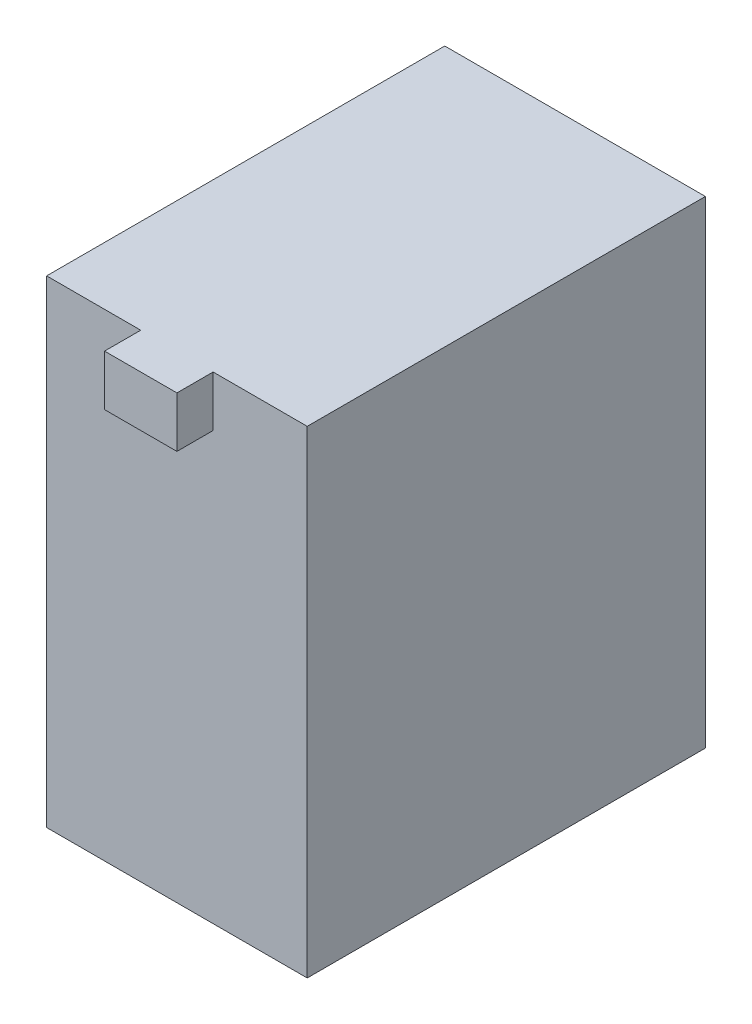
ISO-10303-21;
HEADER;
FILE_DESCRIPTION(('STEP AP214'),'2;1');
FILE_NAME('part.step','',(''),(''),'','','');
FILE_SCHEMA(('AUTOMOTIVE_DESIGN { 1 0 10303 214 1 1 1 1 }'));
ENDSEC;
DATA;
#1=APPLICATION_CONTEXT('core data for automotive mechanical design processes');
#2=APPLICATION_PROTOCOL_DEFINITION('international standard','automotive_design',2000,#1);
#3=PRODUCT_CONTEXT('',#1,'mechanical');
#4=PRODUCT('Part','Part','',(#3));
#5=PRODUCT_RELATED_PRODUCT_CATEGORY('part','',(#4));
#6=PRODUCT_DEFINITION_FORMATION('','',#4);
#7=PRODUCT_DEFINITION_CONTEXT('part definition',#1,'design');
#8=PRODUCT_DEFINITION('design','',#6,#7);
#9=PRODUCT_DEFINITION_SHAPE('','',#8);
#10=(LENGTH_UNIT() NAMED_UNIT(*) SI_UNIT(.MILLI.,.METRE.));
#11=(NAMED_UNIT(*) PLANE_ANGLE_UNIT() SI_UNIT($,.RADIAN.));
#12=(NAMED_UNIT(*) SI_UNIT($,.STERADIAN.) SOLID_ANGLE_UNIT());
#13=UNCERTAINTY_MEASURE_WITH_UNIT(LENGTH_MEASURE(1.E-05),#10,'distance_accuracy_value','');
#14=(GEOMETRIC_REPRESENTATION_CONTEXT(3) GLOBAL_UNCERTAINTY_ASSIGNED_CONTEXT((#13)) GLOBAL_UNIT_ASSIGNED_CONTEXT((#10,
#11,#12)) REPRESENTATION_CONTEXT('',''));
#15=CARTESIAN_POINT('',(0.,0.,0.));
#16=DIRECTION('',(0.,0.,1.));
#17=DIRECTION('',(1.,0.,0.));
#18=AXIS2_PLACEMENT_3D('',#15,#16,#17);
#19=CARTESIAN_POINT('',(-18.,66.,27.5));
#20=DIRECTION('',(0.,0.,-1.));
#21=DIRECTION('',(-1.,0.,0.));
#22=AXIS2_PLACEMENT_3D('',#19,#20,#21);
#23=PLANE('',#22);
#24=DIRECTION('',(0.,1.,0.));
#25=VECTOR('',#24,1.);
#26=CARTESIAN_POINT('',(5.,66.,27.5));
#27=LINE('',#26,#25);
#28=CARTESIAN_POINT('',(5.,59.,27.5));
#29=VERTEX_POINT('',#28);
#30=CARTESIAN_POINT('',(5.,66.,27.5));
#31=VERTEX_POINT('',#30);
#32=EDGE_CURVE('E55',#29,#31,#27,.T.);
#33=ORIENTED_EDGE('',*,*,#32,.F.);
#34=DIRECTION('',(1.,0.,0.));
#35=VECTOR('',#34,1.);
#36=CARTESIAN_POINT('',(5.,59.,27.5));
#37=LINE('',#36,#35);
#38=CARTESIAN_POINT('',(-5.,59.,27.5));
#39=VERTEX_POINT('',#38);
#40=EDGE_CURVE('E124',#39,#29,#37,.T.);
#41=ORIENTED_EDGE('',*,*,#40,.F.);
#42=DIRECTION('',(0.,-1.,0.));
#43=VECTOR('',#42,1.);
#44=CARTESIAN_POINT('',(-5.,66.,27.5));
#45=LINE('',#44,#43);
#46=CARTESIAN_POINT('',(-5.,66.,27.5));
#47=VERTEX_POINT('',#46);
#48=EDGE_CURVE('E280',#47,#39,#45,.T.);
#49=ORIENTED_EDGE('',*,*,#48,.F.);
#50=DIRECTION('',(1.,0.,0.));
#51=VECTOR('',#50,1.);
#52=CARTESIAN_POINT('',(-18.,66.,27.5));
#53=LINE('',#52,#51);
#54=CARTESIAN_POINT('',(-18.,66.,27.5));
#55=VERTEX_POINT('',#54);
#56=EDGE_CURVE('E143',#55,#47,#53,.T.);
#57=ORIENTED_EDGE('',*,*,#56,.F.);
#58=DIRECTION('',(0.,-1.,0.));
#59=VECTOR('',#58,1.);
#60=CARTESIAN_POINT('',(-18.,66.,27.5));
#61=LINE('',#60,#59);
#62=CARTESIAN_POINT('',(-18.,0.,27.5));
#63=VERTEX_POINT('',#62);
#64=EDGE_CURVE('E152',#55,#63,#61,.T.);
#65=ORIENTED_EDGE('',*,*,#64,.T.);
#66=DIRECTION('',(1.,0.,0.));
#67=VECTOR('',#66,1.);
#68=CARTESIAN_POINT('',(-18.,0.,27.5));
#69=LINE('',#68,#67);
#70=CARTESIAN_POINT('',(18.,0.,27.5));
#71=VERTEX_POINT('',#70);
#72=EDGE_CURVE('E139',#63,#71,#69,.T.);
#73=ORIENTED_EDGE('',*,*,#72,.T.);
#74=DIRECTION('',(0.,-1.,0.));
#75=VECTOR('',#74,1.);
#76=CARTESIAN_POINT('',(18.,66.,27.5));
#77=LINE('',#76,#75);
#78=CARTESIAN_POINT('',(18.,66.,27.5));
#79=VERTEX_POINT('',#78);
#80=EDGE_CURVE('E144',#79,#71,#77,.T.);
#81=ORIENTED_EDGE('',*,*,#80,.F.);
#82=EDGE_CURVE('E60',#31,#79,#53,.T.);
#83=ORIENTED_EDGE('',*,*,#82,.F.);
#84=EDGE_LOOP('',(#33,#41,#49,#57,#65,#73,#81,#83));
#85=FACE_BOUND('',#84,.T.);
#86=ADVANCED_FACE('F40',(#85),#23,.F.);
#87=CARTESIAN_POINT('',(18.,66.,27.5));
#88=DIRECTION('',(-1.,0.,0.));
#89=DIRECTION('',(0.,0.,1.));
#90=AXIS2_PLACEMENT_3D('',#87,#88,#89);
#91=PLANE('',#90);
#92=DIRECTION('',(0.,0.,-1.));
#93=VECTOR('',#92,1.);
#94=CARTESIAN_POINT('',(18.,0.,27.5));
#95=LINE('',#94,#93);
#96=CARTESIAN_POINT('',(18.,0.,-27.5));
#97=VERTEX_POINT('',#96);
#98=EDGE_CURVE('E127',#71,#97,#95,.T.);
#99=ORIENTED_EDGE('',*,*,#98,.T.);
#100=DIRECTION('',(0.,-1.,0.));
#101=VECTOR('',#100,1.);
#102=CARTESIAN_POINT('',(18.,66.,-27.5));
#103=LINE('',#102,#101);
#104=CARTESIAN_POINT('',(18.,66.,-27.5));
#105=VERTEX_POINT('',#104);
#106=EDGE_CURVE('E11',#105,#97,#103,.T.);
#107=ORIENTED_EDGE('',*,*,#106,.F.);
#108=DIRECTION('',(0.,0.,-1.));
#109=VECTOR('',#108,1.);
#110=CARTESIAN_POINT('',(18.,66.,27.5));
#111=LINE('',#110,#109);
#112=EDGE_CURVE('E136',#79,#105,#111,.T.);
#113=ORIENTED_EDGE('',*,*,#112,.F.);
#114=ORIENTED_EDGE('',*,*,#80,.T.);
#115=EDGE_LOOP('',(#99,#107,#113,#114));
#116=FACE_BOUND('',#115,.T.);
#117=ADVANCED_FACE('F42',(#116),#91,.F.);
#118=CARTESIAN_POINT('',(-18.,66.,-27.5));
#119=DIRECTION('',(0.,0.,1.));
#120=DIRECTION('',(1.,0.,0.));
#121=AXIS2_PLACEMENT_3D('',#118,#119,#120);
#122=PLANE('',#121);
#123=DIRECTION('',(-1.,0.,0.));
#124=VECTOR('',#123,1.);
#125=CARTESIAN_POINT('',(-18.,0.,-27.5));
#126=LINE('',#125,#124);
#127=CARTESIAN_POINT('',(-18.,0.,-27.5));
#128=VERTEX_POINT('',#127);
#129=EDGE_CURVE('E130',#97,#128,#126,.T.);
#130=ORIENTED_EDGE('',*,*,#129,.T.);
#131=DIRECTION('',(0.,-1.,0.));
#132=VECTOR('',#131,1.);
#133=CARTESIAN_POINT('',(-18.,66.,-27.5));
#134=LINE('',#133,#132);
#135=CARTESIAN_POINT('',(-18.,66.,-27.5));
#136=VERTEX_POINT('',#135);
#137=EDGE_CURVE('E48',#136,#128,#134,.T.);
#138=ORIENTED_EDGE('',*,*,#137,.F.);
#139=DIRECTION('',(-1.,0.,0.));
#140=VECTOR('',#139,1.);
#141=CARTESIAN_POINT('',(-18.,66.,-27.5));
#142=LINE('',#141,#140);
#143=EDGE_CURVE('E138',#105,#136,#142,.T.);
#144=ORIENTED_EDGE('',*,*,#143,.F.);
#145=ORIENTED_EDGE('',*,*,#106,.T.);
#146=EDGE_LOOP('',(#130,#138,#144,#145));
#147=FACE_BOUND('',#146,.T.);
#148=ADVANCED_FACE('F170',(#147),#122,.F.);
#149=CARTESIAN_POINT('',(-18.,66.,27.5));
#150=DIRECTION('',(1.,0.,0.));
#151=DIRECTION('',(0.,0.,-1.));
#152=AXIS2_PLACEMENT_3D('',#149,#150,#151);
#153=PLANE('',#152);
#154=DIRECTION('',(0.,0.,1.));
#155=VECTOR('',#154,1.);
#156=CARTESIAN_POINT('',(-18.,0.,27.5));
#157=LINE('',#156,#155);
#158=EDGE_CURVE('E147',#128,#63,#157,.T.);
#159=ORIENTED_EDGE('',*,*,#158,.T.);
#160=ORIENTED_EDGE('',*,*,#64,.F.);
#161=DIRECTION('',(0.,0.,1.));
#162=VECTOR('',#161,1.);
#163=CARTESIAN_POINT('',(-18.,66.,27.5));
#164=LINE('',#163,#162);
#165=EDGE_CURVE('E141',#136,#55,#164,.T.);
#166=ORIENTED_EDGE('',*,*,#165,.F.);
#167=ORIENTED_EDGE('',*,*,#137,.T.);
#168=EDGE_LOOP('',(#159,#160,#166,#167));
#169=FACE_BOUND('',#168,.T.);
#170=ADVANCED_FACE('F159',(#169),#153,.F.);
#171=CARTESIAN_POINT('',(0.,66.,0.));
#172=DIRECTION('',(0.,-1.,0.));
#173=DIRECTION('',(0.,0.,-1.));
#174=AXIS2_PLACEMENT_3D('',#171,#172,#173);
#175=PLANE('',#174);
#176=ORIENTED_EDGE('',*,*,#112,.T.);
#177=ORIENTED_EDGE('',*,*,#143,.T.);
#178=ORIENTED_EDGE('',*,*,#165,.T.);
#179=ORIENTED_EDGE('',*,*,#56,.T.);
#180=DIRECTION('',(0.,0.,-1.));
#181=VECTOR('',#180,1.);
#182=CARTESIAN_POINT('',(-5.,66.,32.5));
#183=LINE('',#182,#181);
#184=CARTESIAN_POINT('',(-5.,66.,32.5));
#185=VERTEX_POINT('',#184);
#186=EDGE_CURVE('E111',#185,#47,#183,.T.);
#187=ORIENTED_EDGE('',*,*,#186,.F.);
#188=DIRECTION('',(-1.,0.,0.));
#189=VECTOR('',#188,1.);
#190=CARTESIAN_POINT('',(-5.,66.,32.5));
#191=LINE('',#190,#189);
#192=CARTESIAN_POINT('',(5.,66.,32.5));
#193=VERTEX_POINT('',#192);
#194=EDGE_CURVE('E103',#193,#185,#191,.T.);
#195=ORIENTED_EDGE('',*,*,#194,.F.);
#196=DIRECTION('',(0.,0.,-1.));
#197=VECTOR('',#196,1.);
#198=CARTESIAN_POINT('',(5.,66.,32.5));
#199=LINE('',#198,#197);
#200=EDGE_CURVE('E108',#193,#31,#199,.T.);
#201=ORIENTED_EDGE('',*,*,#200,.T.);
#202=ORIENTED_EDGE('',*,*,#82,.T.);
#203=EDGE_LOOP('',(#176,#177,#178,#179,#187,#195,#201,#202));
#204=FACE_BOUND('',#203,.T.);
#205=ADVANCED_FACE('F106',(#204),#175,.F.);
#206=CARTESIAN_POINT('',(0.,0.,0.));
#207=DIRECTION('',(0.,-1.,0.));
#208=DIRECTION('',(0.,0.,-1.));
#209=AXIS2_PLACEMENT_3D('',#206,#207,#208);
#210=PLANE('',#209);
#211=ORIENTED_EDGE('',*,*,#98,.F.);
#212=ORIENTED_EDGE('',*,*,#72,.F.);
#213=ORIENTED_EDGE('',*,*,#158,.F.);
#214=ORIENTED_EDGE('',*,*,#129,.F.);
#215=EDGE_LOOP('',(#211,#212,#213,#214));
#216=FACE_BOUND('',#215,.T.);
#217=ADVANCED_FACE('F165',(#216),#210,.T.);
#218=CARTESIAN_POINT('',(5.,66.,32.5));
#219=DIRECTION('',(-1.,0.,0.));
#220=DIRECTION('',(0.,-1.,0.));
#221=AXIS2_PLACEMENT_3D('',#218,#219,#220);
#222=PLANE('',#221);
#223=ORIENTED_EDGE('',*,*,#32,.T.);
#224=ORIENTED_EDGE('',*,*,#200,.F.);
#225=DIRECTION('',(0.,1.,0.));
#226=VECTOR('',#225,1.);
#227=CARTESIAN_POINT('',(5.,66.,32.5));
#228=LINE('',#227,#226);
#229=CARTESIAN_POINT('',(5.,59.,32.5));
#230=VERTEX_POINT('',#229);
#231=EDGE_CURVE('E115',#230,#193,#228,.T.);
#232=ORIENTED_EDGE('',*,*,#231,.F.);
#233=DIRECTION('',(0.,0.,-1.));
#234=VECTOR('',#233,1.);
#235=CARTESIAN_POINT('',(5.,59.,32.5));
#236=LINE('',#235,#234);
#237=EDGE_CURVE('E277',#230,#29,#236,.T.);
#238=ORIENTED_EDGE('',*,*,#237,.T.);
#239=EDGE_LOOP('',(#223,#224,#232,#238));
#240=FACE_BOUND('',#239,.T.);
#241=ADVANCED_FACE('F126',(#240),#222,.F.);
#242=CARTESIAN_POINT('',(-5.,66.,32.5));
#243=DIRECTION('',(1.,0.,0.));
#244=DIRECTION('',(0.,1.,0.));
#245=AXIS2_PLACEMENT_3D('',#242,#243,#244);
#246=PLANE('',#245);
#247=ORIENTED_EDGE('',*,*,#48,.T.);
#248=DIRECTION('',(0.,0.,-1.));
#249=VECTOR('',#248,1.);
#250=CARTESIAN_POINT('',(-5.,59.,32.5));
#251=LINE('',#250,#249);
#252=CARTESIAN_POINT('',(-5.,59.,32.5));
#253=VERTEX_POINT('',#252);
#254=EDGE_CURVE('E132',#253,#39,#251,.T.);
#255=ORIENTED_EDGE('',*,*,#254,.F.);
#256=DIRECTION('',(0.,-1.,0.));
#257=VECTOR('',#256,1.);
#258=CARTESIAN_POINT('',(-5.,66.,32.5));
#259=LINE('',#258,#257);
#260=EDGE_CURVE('E114',#185,#253,#259,.T.);
#261=ORIENTED_EDGE('',*,*,#260,.F.);
#262=ORIENTED_EDGE('',*,*,#186,.T.);
#263=EDGE_LOOP('',(#247,#255,#261,#262));
#264=FACE_BOUND('',#263,.T.);
#265=ADVANCED_FACE('F188',(#264),#246,.F.);
#266=CARTESIAN_POINT('',(5.,59.,32.5));
#267=DIRECTION('',(0.,1.,0.));
#268=DIRECTION('',(0.,0.,1.));
#269=AXIS2_PLACEMENT_3D('',#266,#267,#268);
#270=PLANE('',#269);
#271=ORIENTED_EDGE('',*,*,#40,.T.);
#272=ORIENTED_EDGE('',*,*,#237,.F.);
#273=DIRECTION('',(1.,0.,0.));
#274=VECTOR('',#273,1.);
#275=CARTESIAN_POINT('',(5.,59.,32.5));
#276=LINE('',#275,#274);
#277=EDGE_CURVE('E120',#253,#230,#276,.T.);
#278=ORIENTED_EDGE('',*,*,#277,.F.);
#279=ORIENTED_EDGE('',*,*,#254,.T.);
#280=EDGE_LOOP('',(#271,#272,#278,#279));
#281=FACE_BOUND('',#280,.T.);
#282=ADVANCED_FACE('F191',(#281),#270,.F.);
#283=CARTESIAN_POINT('',(0.,0.,32.5));
#284=DIRECTION('',(0.,0.,-1.));
#285=DIRECTION('',(-1.,0.,0.));
#286=AXIS2_PLACEMENT_3D('',#283,#284,#285);
#287=PLANE('',#286);
#288=ORIENTED_EDGE('',*,*,#231,.T.);
#289=ORIENTED_EDGE('',*,*,#194,.T.);
#290=ORIENTED_EDGE('',*,*,#260,.T.);
#291=ORIENTED_EDGE('',*,*,#277,.T.);
#292=EDGE_LOOP('',(#288,#289,#290,#291));
#293=FACE_BOUND('',#292,.T.);
#294=ADVANCED_FACE('F118',(#293),#287,.F.);
#295=CLOSED_SHELL('',(#86,#117,#148,#170,#205,#217,#241,#265,#282,#294));
#296=MANIFOLD_SOLID_BREP('B2',#295);
#297=ADVANCED_BREP_SHAPE_REPRESENTATION('',(#18,#296),#14);
#298=SHAPE_DEFINITION_REPRESENTATION(#9,#297);
ENDSEC;
END-ISO-10303-21;
